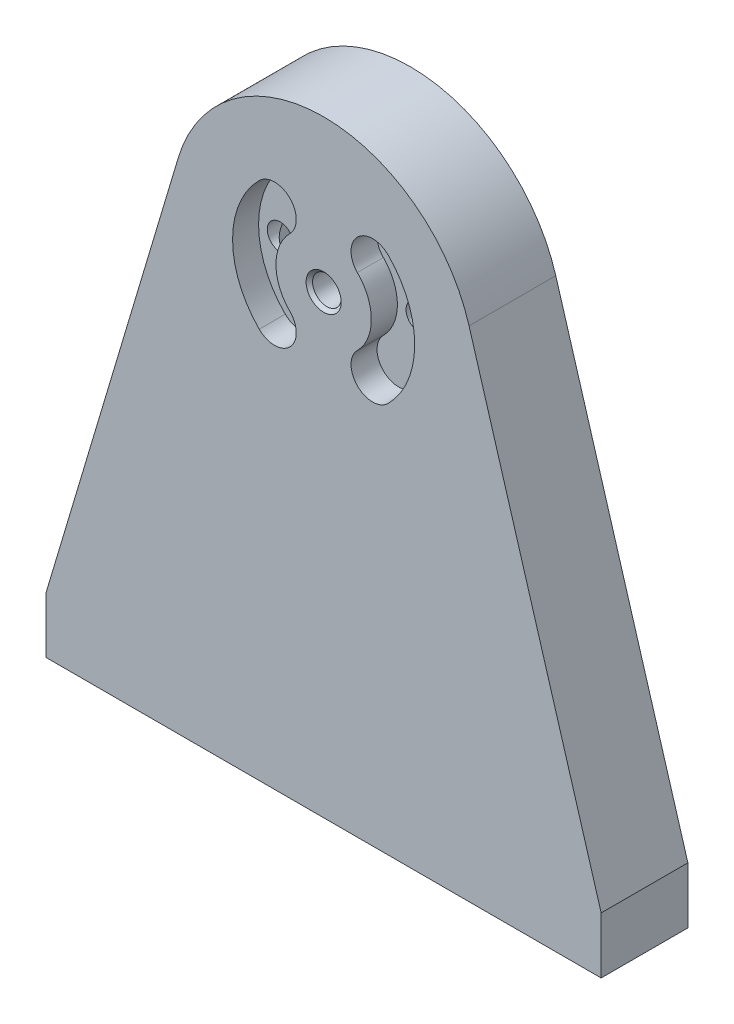
ISO-10303-21;
HEADER;
FILE_DESCRIPTION(('STEP AP214'),'2;1');
FILE_NAME('part.step','',(''),(''),'','','');
FILE_SCHEMA(('AUTOMOTIVE_DESIGN { 1 0 10303 214 1 1 1 1 }'));
ENDSEC;
DATA;
#1=APPLICATION_CONTEXT('core data for automotive mechanical design processes');
#2=APPLICATION_PROTOCOL_DEFINITION('international standard','automotive_design',2000,#1);
#3=PRODUCT_CONTEXT('',#1,'mechanical');
#4=PRODUCT('Part','Part','',(#3));
#5=PRODUCT_RELATED_PRODUCT_CATEGORY('part','',(#4));
#6=PRODUCT_DEFINITION_FORMATION('','',#4);
#7=PRODUCT_DEFINITION_CONTEXT('part definition',#1,'design');
#8=PRODUCT_DEFINITION('design','',#6,#7);
#9=PRODUCT_DEFINITION_SHAPE('','',#8);
#10=(LENGTH_UNIT() NAMED_UNIT(*) SI_UNIT(.MILLI.,.METRE.));
#11=(NAMED_UNIT(*) PLANE_ANGLE_UNIT() SI_UNIT($,.RADIAN.));
#12=(NAMED_UNIT(*) SI_UNIT($,.STERADIAN.) SOLID_ANGLE_UNIT());
#13=UNCERTAINTY_MEASURE_WITH_UNIT(LENGTH_MEASURE(1.E-05),#10,'distance_accuracy_value','');
#14=(GEOMETRIC_REPRESENTATION_CONTEXT(3) GLOBAL_UNCERTAINTY_ASSIGNED_CONTEXT((#13)) GLOBAL_UNIT_ASSIGNED_CONTEXT((#10,
#11,#12)) REPRESENTATION_CONTEXT('',''));
#15=CARTESIAN_POINT('',(0.,0.,0.));
#16=DIRECTION('',(0.,0.,1.));
#17=DIRECTION('',(1.,0.,0.));
#18=AXIS2_PLACEMENT_3D('',#15,#16,#17);
#19=CARTESIAN_POINT('',(7.99999999999999,54.,0.));
#20=DIRECTION('',(0.,-1.,0.));
#21=DIRECTION('',(1.,0.,0.));
#22=AXIS2_PLACEMENT_3D('',#19,#20,#21);
#23=CYLINDRICAL_SURFACE('',#22,1.5);
#24=CARTESIAN_POINT('',(8.,0.,0.));
#25=DIRECTION('',(0.,-1.,0.));
#26=DIRECTION('',(1.,0.,0.));
#27=AXIS2_PLACEMENT_3D('',#24,#25,#26);
#28=CIRCLE('',#27,1.5);
#29=CARTESIAN_POINT('',(9.5,0.,0.));
#30=VERTEX_POINT('',#29);
#31=EDGE_CURVE('E309',#30,#30,#28,.T.);
#32=ORIENTED_EDGE('',*,*,#31,.T.);
#33=EDGE_LOOP('',(#32));
#34=FACE_BOUND('',#33,.T.);
#35=CARTESIAN_POINT('',(7.99999999999999,52.5,0.));
#36=DIRECTION('',(0.,-0.707106781186547,-0.707106781186547));
#37=DIRECTION('',(0.,-0.707106781186547,0.707106781186547));
#38=AXIS2_PLACEMENT_3D('',#35,#36,#37);
#39=ELLIPSE('',#38,2.12132034355964,1.5);
#40=CARTESIAN_POINT('',(6.49999999999999,52.5,0.));
#41=VERTEX_POINT('',#40);
#42=CARTESIAN_POINT('',(9.5,52.5,0.));
#43=VERTEX_POINT('',#42);
#44=EDGE_CURVE('E127',#41,#43,#39,.F.);
#45=ORIENTED_EDGE('',*,*,#44,.T.);
#46=CARTESIAN_POINT('',(7.99999999999999,52.5,0.));
#47=DIRECTION('',(0.,-0.707106781186547,0.707106781186547));
#48=DIRECTION('',(0.,-0.707106781186547,-0.707106781186547));
#49=AXIS2_PLACEMENT_3D('',#46,#47,#48);
#50=ELLIPSE('',#49,2.12132034355964,1.5);
#51=EDGE_CURVE('E475',#43,#41,#50,.F.);
#52=ORIENTED_EDGE('',*,*,#51,.T.);
#53=EDGE_LOOP('',(#45,#52));
#54=FACE_BOUND('',#53,.T.);
#55=ADVANCED_FACE('F109',(#34,#54),#23,.F.);
#56=CARTESIAN_POINT('',(-8.00000000000001,54.,0.));
#57=DIRECTION('',(0.,-1.,0.));
#58=DIRECTION('',(1.,0.,0.));
#59=AXIS2_PLACEMENT_3D('',#56,#57,#58);
#60=CYLINDRICAL_SURFACE('',#59,1.5);
#61=CARTESIAN_POINT('',(-8.,0.,0.));
#62=DIRECTION('',(0.,-1.,0.));
#63=DIRECTION('',(1.,0.,0.));
#64=AXIS2_PLACEMENT_3D('',#61,#62,#63);
#65=CIRCLE('',#64,1.5);
#66=CARTESIAN_POINT('',(-6.5,0.,0.));
#67=VERTEX_POINT('',#66);
#68=EDGE_CURVE('E288',#67,#67,#65,.T.);
#69=ORIENTED_EDGE('',*,*,#68,.T.);
#70=EDGE_LOOP('',(#69));
#71=FACE_BOUND('',#70,.T.);
#72=CARTESIAN_POINT('',(-8.00000000000001,52.5,0.));
#73=DIRECTION('',(0.,-0.707106781186547,-0.707106781186547));
#74=DIRECTION('',(0.,-0.707106781186547,0.707106781186547));
#75=AXIS2_PLACEMENT_3D('',#72,#73,#74);
#76=ELLIPSE('',#75,2.12132034355964,1.5);
#77=CARTESIAN_POINT('',(-9.50000000000001,52.5,0.));
#78=VERTEX_POINT('',#77);
#79=CARTESIAN_POINT('',(-6.50000000000001,52.5,0.));
#80=VERTEX_POINT('',#79);
#81=EDGE_CURVE('E136',#78,#80,#76,.F.);
#82=ORIENTED_EDGE('',*,*,#81,.T.);
#83=CARTESIAN_POINT('',(-8.00000000000001,52.5,0.));
#84=DIRECTION('',(0.,-0.707106781186547,0.707106781186547));
#85=DIRECTION('',(0.,-0.707106781186547,-0.707106781186547));
#86=AXIS2_PLACEMENT_3D('',#83,#84,#85);
#87=ELLIPSE('',#86,2.12132034355964,1.5);
#88=EDGE_CURVE('E266',#80,#78,#87,.F.);
#89=ORIENTED_EDGE('',*,*,#88,.T.);
#90=EDGE_LOOP('',(#82,#89));
#91=FACE_BOUND('',#90,.T.);
#92=ADVANCED_FACE('F428',(#71,#91),#60,.F.);
#93=CARTESIAN_POINT('',(0.,0.,5.));
#94=DIRECTION('',(0.,0.,1.));
#95=DIRECTION('',(1.,0.,0.));
#96=AXIS2_PLACEMENT_3D('',#93,#94,#95);
#97=PLANE('',#96);
#98=CARTESIAN_POINT('',(5.65685424949235,46.8431457505076,5.));
#99=DIRECTION('',(0.,0.,1.));
#100=DIRECTION('',(1.,0.,0.));
#101=AXIS2_PLACEMENT_3D('',#98,#99,#100);
#102=CIRCLE('',#101,2.5);
#103=CARTESIAN_POINT('',(3.88908729652599,48.610912703474,5.));
#104=VERTEX_POINT('',#103);
#105=CARTESIAN_POINT('',(7.42462120245871,45.0753787975412,5.));
#106=VERTEX_POINT('',#105);
#107=EDGE_CURVE('E502',#104,#106,#102,.T.);
#108=ORIENTED_EDGE('',*,*,#107,.F.);
#109=CARTESIAN_POINT('',(0.,52.5,5.));
#110=DIRECTION('',(0.,0.,1.));
#111=DIRECTION('',(1.,0.,0.));
#112=AXIS2_PLACEMENT_3D('',#109,#110,#111);
#113=CIRCLE('',#112,5.5);
#114=CARTESIAN_POINT('',(3.88908729652599,56.389087296526,5.));
#115=VERTEX_POINT('',#114);
#116=EDGE_CURVE('E533',#104,#115,#113,.T.);
#117=ORIENTED_EDGE('',*,*,#116,.T.);
#118=CARTESIAN_POINT('',(5.65685424949235,58.1568542494924,5.));
#119=DIRECTION('',(0.,0.,1.));
#120=DIRECTION('',(1.,0.,0.));
#121=AXIS2_PLACEMENT_3D('',#118,#119,#120);
#122=CIRCLE('',#121,2.5);
#123=CARTESIAN_POINT('',(7.42462120245871,59.9246212024588,5.));
#124=VERTEX_POINT('',#123);
#125=EDGE_CURVE('E537',#124,#115,#122,.T.);
#126=ORIENTED_EDGE('',*,*,#125,.F.);
#127=CARTESIAN_POINT('',(0.,52.5,5.));
#128=DIRECTION('',(0.,0.,1.));
#129=DIRECTION('',(1.,0.,0.));
#130=AXIS2_PLACEMENT_3D('',#127,#128,#129);
#131=CIRCLE('',#130,10.5);
#132=EDGE_CURVE('E540',#106,#124,#131,.T.);
#133=ORIENTED_EDGE('',*,*,#132,.F.);
#134=EDGE_LOOP('',(#108,#117,#126,#133));
#135=FACE_BOUND('',#134,.T.);
#136=CARTESIAN_POINT('',(0.,52.5,5.));
#137=DIRECTION('',(0.,0.,1.));
#138=DIRECTION('',(1.,0.,0.));
#139=AXIS2_PLACEMENT_3D('',#136,#137,#138);
#140=CIRCLE('',#139,2.025);
#141=CARTESIAN_POINT('',(2.025,52.5,5.));
#142=VERTEX_POINT('',#141);
#143=EDGE_CURVE('E327',#142,#142,#140,.T.);
#144=ORIENTED_EDGE('',*,*,#143,.F.);
#145=EDGE_LOOP('',(#144));
#146=FACE_BOUND('',#145,.T.);
#147=DIRECTION('',(-0.286132264969927,0.958190130894271,0.));
#148=VECTOR('',#147,1.);
#149=CARTESIAN_POINT('',(31.1622056929417,9.30557747245682,5.));
#150=LINE('',#149,#148);
#151=CARTESIAN_POINT('',(32.,6.50000000000001,5.));
#152=VERTEX_POINT('',#151);
#153=CARTESIAN_POINT('',(16.7683272906497,57.5073146369737,5.));
#154=VERTEX_POINT('',#153);
#155=EDGE_CURVE('E340',#152,#154,#150,.T.);
#156=ORIENTED_EDGE('',*,*,#155,.T.);
#157=CARTESIAN_POINT('',(0.,52.5,5.));
#158=DIRECTION('',(0.,0.,1.));
#159=DIRECTION('',(1.,0.,0.));
#160=AXIS2_PLACEMENT_3D('',#157,#158,#159);
#161=CIRCLE('',#160,17.5);
#162=CARTESIAN_POINT('',(-16.7683272906497,57.5073146369737,5.));
#163=VERTEX_POINT('',#162);
#164=EDGE_CURVE('E344',#154,#163,#161,.T.);
#165=ORIENTED_EDGE('',*,*,#164,.T.);
#166=DIRECTION('',(0.286132264969927,0.958190130894271,0.));
#167=VECTOR('',#166,1.);
#168=CARTESIAN_POINT('',(-31.1622056929417,9.30557747245681,5.));
#169=LINE('',#168,#167);
#170=CARTESIAN_POINT('',(-32.,6.5,5.));
#171=VERTEX_POINT('',#170);
#172=EDGE_CURVE('E348',#171,#163,#169,.T.);
#173=ORIENTED_EDGE('',*,*,#172,.F.);
#174=DIRECTION('',(0.,1.,0.));
#175=VECTOR('',#174,1.);
#176=CARTESIAN_POINT('',(-32.,0.,5.));
#177=LINE('',#176,#175);
#178=CARTESIAN_POINT('',(-32.,0.,5.));
#179=VERTEX_POINT('',#178);
#180=EDGE_CURVE('E352',#179,#171,#177,.T.);
#181=ORIENTED_EDGE('',*,*,#180,.F.);
#182=DIRECTION('',(1.,0.,0.));
#183=VECTOR('',#182,1.);
#184=CARTESIAN_POINT('',(0.,0.,5.));
#185=LINE('',#184,#183);
#186=CARTESIAN_POINT('',(32.,0.,5.));
#187=VERTEX_POINT('',#186);
#188=EDGE_CURVE('E355',#179,#187,#185,.T.);
#189=ORIENTED_EDGE('',*,*,#188,.T.);
#190=DIRECTION('',(0.,1.,0.));
#191=VECTOR('',#190,1.);
#192=CARTESIAN_POINT('',(32.,0.,5.));
#193=LINE('',#192,#191);
#194=EDGE_CURVE('E358',#187,#152,#193,.T.);
#195=ORIENTED_EDGE('',*,*,#194,.T.);
#196=EDGE_LOOP('',(#156,#165,#173,#181,#189,#195));
#197=FACE_BOUND('',#196,.T.);
#198=CARTESIAN_POINT('',(0.,52.5,5.));
#199=DIRECTION('',(0.,0.,-1.));
#200=DIRECTION('',(-1.,0.,0.));
#201=AXIS2_PLACEMENT_3D('',#198,#199,#200);
#202=CIRCLE('',#201,5.5);
#203=CARTESIAN_POINT('',(-3.88908729652599,48.610912703474,5.));
#204=VERTEX_POINT('',#203);
#205=CARTESIAN_POINT('',(-3.88908729652599,56.389087296526,5.));
#206=VERTEX_POINT('',#205);
#207=EDGE_CURVE('E486',#204,#206,#202,.T.);
#208=ORIENTED_EDGE('',*,*,#207,.F.);
#209=CARTESIAN_POINT('',(-5.65685424949235,46.8431457505076,5.));
#210=DIRECTION('',(0.,0.,-1.));
#211=DIRECTION('',(-1.,0.,0.));
#212=AXIS2_PLACEMENT_3D('',#209,#210,#211);
#213=CIRCLE('',#212,2.5);
#214=CARTESIAN_POINT('',(-7.42462120245871,45.0753787975412,5.));
#215=VERTEX_POINT('',#214);
#216=EDGE_CURVE('E497',#204,#215,#213,.T.);
#217=ORIENTED_EDGE('',*,*,#216,.T.);
#218=CARTESIAN_POINT('',(0.,52.5,5.));
#219=DIRECTION('',(0.,0.,-1.));
#220=DIRECTION('',(-1.,0.,0.));
#221=AXIS2_PLACEMENT_3D('',#218,#219,#220);
#222=CIRCLE('',#221,10.5);
#223=CARTESIAN_POINT('',(-7.42462120245871,59.9246212024588,5.));
#224=VERTEX_POINT('',#223);
#225=EDGE_CURVE('E501',#215,#224,#222,.T.);
#226=ORIENTED_EDGE('',*,*,#225,.T.);
#227=CARTESIAN_POINT('',(-5.65685424949235,58.1568542494924,5.));
#228=DIRECTION('',(0.,0.,-1.));
#229=DIRECTION('',(-1.,0.,0.));
#230=AXIS2_PLACEMENT_3D('',#227,#228,#229);
#231=CIRCLE('',#230,2.5);
#232=EDGE_CURVE('E505',#224,#206,#231,.T.);
#233=ORIENTED_EDGE('',*,*,#232,.T.);
#234=EDGE_LOOP('',(#208,#217,#226,#233));
#235=FACE_BOUND('',#234,.T.);
#236=ADVANCED_FACE('F405',(#135,#146,#197,#235),#97,.T.);
#237=CARTESIAN_POINT('',(0.,52.5,5.));
#238=DIRECTION('',(0.,0.,-1.));
#239=DIRECTION('',(-1.,0.,0.));
#240=AXIS2_PLACEMENT_3D('',#237,#238,#239);
#241=CYLINDRICAL_SURFACE('',#240,17.5);
#242=CARTESIAN_POINT('',(0.,52.5,-5.));
#243=DIRECTION('',(0.,0.,1.));
#244=DIRECTION('',(1.,0.,0.));
#245=AXIS2_PLACEMENT_3D('',#242,#243,#244);
#246=CIRCLE('',#245,17.5);
#247=CARTESIAN_POINT('',(16.7683272906497,57.5073146369737,-5.));
#248=VERTEX_POINT('',#247);
#249=CARTESIAN_POINT('',(-16.7683272906497,57.5073146369737,-5.));
#250=VERTEX_POINT('',#249);
#251=EDGE_CURVE('E364',#248,#250,#246,.T.);
#252=ORIENTED_EDGE('',*,*,#251,.T.);
#253=DIRECTION('',(0.,0.,-1.));
#254=VECTOR('',#253,1.);
#255=CARTESIAN_POINT('',(-16.7683272906497,57.5073146369737,5.));
#256=LINE('',#255,#254);
#257=EDGE_CURVE('E118',#163,#250,#256,.T.);
#258=ORIENTED_EDGE('',*,*,#257,.F.);
#259=ORIENTED_EDGE('',*,*,#164,.F.);
#260=DIRECTION('',(0.,0.,-1.));
#261=VECTOR('',#260,1.);
#262=CARTESIAN_POINT('',(16.7683272906497,57.5073146369737,5.));
#263=LINE('',#262,#261);
#264=EDGE_CURVE('E12',#154,#248,#263,.T.);
#265=ORIENTED_EDGE('',*,*,#264,.T.);
#266=EDGE_LOOP('',(#252,#258,#259,#265));
#267=FACE_BOUND('',#266,.T.);
#268=ADVANCED_FACE('F392',(#267),#241,.T.);
#269=CARTESIAN_POINT('',(-31.1622056929417,9.30557747245681,5.));
#270=DIRECTION('',(-0.958190130894271,0.286132264969927,0.));
#271=DIRECTION('',(-0.286132264969927,-0.958190130894271,0.));
#272=AXIS2_PLACEMENT_3D('',#269,#270,#271);
#273=PLANE('',#272);
#274=DIRECTION('',(0.286132264969927,0.958190130894271,0.));
#275=VECTOR('',#274,1.);
#276=CARTESIAN_POINT('',(-31.1622056929417,9.30557747245681,-5.));
#277=LINE('',#276,#275);
#278=CARTESIAN_POINT('',(-32.,6.5,-5.));
#279=VERTEX_POINT('',#278);
#280=EDGE_CURVE('E368',#279,#250,#277,.T.);
#281=ORIENTED_EDGE('',*,*,#280,.F.);
#282=DIRECTION('',(0.,0.,-1.));
#283=VECTOR('',#282,1.);
#284=CARTESIAN_POINT('',(-32.,6.5,5.));
#285=LINE('',#284,#283);
#286=EDGE_CURVE('E385',#171,#279,#285,.T.);
#287=ORIENTED_EDGE('',*,*,#286,.F.);
#288=ORIENTED_EDGE('',*,*,#172,.T.);
#289=ORIENTED_EDGE('',*,*,#257,.T.);
#290=EDGE_LOOP('',(#281,#287,#288,#289));
#291=FACE_BOUND('',#290,.T.);
#292=ADVANCED_FACE('F389',(#291),#273,.T.);
#293=CARTESIAN_POINT('',(-32.,0.,5.));
#294=DIRECTION('',(-1.,0.,0.));
#295=DIRECTION('',(0.,0.,1.));
#296=AXIS2_PLACEMENT_3D('',#293,#294,#295);
#297=PLANE('',#296);
#298=DIRECTION('',(0.,1.,0.));
#299=VECTOR('',#298,1.);
#300=CARTESIAN_POINT('',(-32.,0.,-5.));
#301=LINE('',#300,#299);
#302=CARTESIAN_POINT('',(-32.,0.,-5.));
#303=VERTEX_POINT('',#302);
#304=EDGE_CURVE('E372',#303,#279,#301,.T.);
#305=ORIENTED_EDGE('',*,*,#304,.F.);
#306=DIRECTION('',(0.,0.,-1.));
#307=VECTOR('',#306,1.);
#308=CARTESIAN_POINT('',(-32.,0.,5.));
#309=LINE('',#308,#307);
#310=EDGE_CURVE('E383',#179,#303,#309,.T.);
#311=ORIENTED_EDGE('',*,*,#310,.F.);
#312=ORIENTED_EDGE('',*,*,#180,.T.);
#313=ORIENTED_EDGE('',*,*,#286,.T.);
#314=EDGE_LOOP('',(#305,#311,#312,#313));
#315=FACE_BOUND('',#314,.T.);
#316=ADVANCED_FACE('F401',(#315),#297,.T.);
#317=CARTESIAN_POINT('',(0.,0.,5.));
#318=DIRECTION('',(0.,1.,0.));
#319=DIRECTION('',(-1.,0.,0.));
#320=AXIS2_PLACEMENT_3D('',#317,#318,#319);
#321=PLANE('',#320);
#322=ORIENTED_EDGE('',*,*,#68,.F.);
#323=EDGE_LOOP('',(#322));
#324=FACE_BOUND('',#323,.T.);
#325=ORIENTED_EDGE('',*,*,#31,.F.);
#326=EDGE_LOOP('',(#325));
#327=FACE_BOUND('',#326,.T.);
#328=CARTESIAN_POINT('',(-22.,0.,0.));
#329=DIRECTION('',(0.,-1.,0.));
#330=DIRECTION('',(0.,0.,-1.));
#331=AXIS2_PLACEMENT_3D('',#328,#329,#330);
#332=CIRCLE('',#331,2.025);
#333=CARTESIAN_POINT('',(-22.,0.,-2.025));
#334=VERTEX_POINT('',#333);
#335=EDGE_CURVE('E292',#334,#334,#332,.T.);
#336=ORIENTED_EDGE('',*,*,#335,.F.);
#337=EDGE_LOOP('',(#336));
#338=FACE_BOUND('',#337,.T.);
#339=CARTESIAN_POINT('',(22.,0.,0.));
#340=DIRECTION('',(0.,-1.,0.));
#341=DIRECTION('',(0.,0.,-1.));
#342=AXIS2_PLACEMENT_3D('',#339,#340,#341);
#343=CIRCLE('',#342,2.025);
#344=CARTESIAN_POINT('',(22.,0.,-2.025));
#345=VERTEX_POINT('',#344);
#346=EDGE_CURVE('E318',#345,#345,#343,.T.);
#347=ORIENTED_EDGE('',*,*,#346,.F.);
#348=EDGE_LOOP('',(#347));
#349=FACE_BOUND('',#348,.T.);
#350=DIRECTION('',(1.,0.,0.));
#351=VECTOR('',#350,1.);
#352=CARTESIAN_POINT('',(0.,0.,-5.));
#353=LINE('',#352,#351);
#354=CARTESIAN_POINT('',(32.,0.,-5.));
#355=VERTEX_POINT('',#354);
#356=EDGE_CURVE('E375',#303,#355,#353,.T.);
#357=ORIENTED_EDGE('',*,*,#356,.T.);
#358=DIRECTION('',(0.,0.,-1.));
#359=VECTOR('',#358,1.);
#360=CARTESIAN_POINT('',(32.,0.,5.));
#361=LINE('',#360,#359);
#362=EDGE_CURVE('E380',#187,#355,#361,.T.);
#363=ORIENTED_EDGE('',*,*,#362,.F.);
#364=ORIENTED_EDGE('',*,*,#188,.F.);
#365=ORIENTED_EDGE('',*,*,#310,.T.);
#366=EDGE_LOOP('',(#357,#363,#364,#365));
#367=FACE_BOUND('',#366,.T.);
#368=ADVANCED_FACE('F415',(#324,#327,#338,#349,#367),#321,.F.);
#369=CARTESIAN_POINT('',(32.,0.,5.));
#370=DIRECTION('',(-1.,0.,0.));
#371=DIRECTION('',(0.,0.,1.));
#372=AXIS2_PLACEMENT_3D('',#369,#370,#371);
#373=PLANE('',#372);
#374=DIRECTION('',(0.,1.,0.));
#375=VECTOR('',#374,1.);
#376=CARTESIAN_POINT('',(32.,0.,-5.));
#377=LINE('',#376,#375);
#378=CARTESIAN_POINT('',(32.,6.50000000000001,-5.));
#379=VERTEX_POINT('',#378);
#380=EDGE_CURVE('E345',#355,#379,#377,.T.);
#381=ORIENTED_EDGE('',*,*,#380,.T.);
#382=DIRECTION('',(0.,0.,-1.));
#383=VECTOR('',#382,1.);
#384=CARTESIAN_POINT('',(32.,6.50000000000001,5.));
#385=LINE('',#384,#383);
#386=EDGE_CURVE('E360',#152,#379,#385,.T.);
#387=ORIENTED_EDGE('',*,*,#386,.F.);
#388=ORIENTED_EDGE('',*,*,#194,.F.);
#389=ORIENTED_EDGE('',*,*,#362,.T.);
#390=EDGE_LOOP('',(#381,#387,#388,#389));
#391=FACE_BOUND('',#390,.T.);
#392=ADVANCED_FACE('F412',(#391),#373,.F.);
#393=CARTESIAN_POINT('',(31.1622056929417,9.30557747245682,5.));
#394=DIRECTION('',(-0.958190130894271,-0.286132264969927,0.));
#395=DIRECTION('',(0.286132264969927,-0.958190130894271,0.));
#396=AXIS2_PLACEMENT_3D('',#393,#394,#395);
#397=PLANE('',#396);
#398=DIRECTION('',(-0.286132264969927,0.958190130894271,0.));
#399=VECTOR('',#398,1.);
#400=CARTESIAN_POINT('',(31.1622056929417,9.30557747245682,-5.));
#401=LINE('',#400,#399);
#402=EDGE_CURVE('E339',#379,#248,#401,.T.);
#403=ORIENTED_EDGE('',*,*,#402,.T.);
#404=ORIENTED_EDGE('',*,*,#264,.F.);
#405=ORIENTED_EDGE('',*,*,#155,.F.);
#406=ORIENTED_EDGE('',*,*,#386,.T.);
#407=EDGE_LOOP('',(#403,#404,#405,#406));
#408=FACE_BOUND('',#407,.T.);
#409=ADVANCED_FACE('F111',(#408),#397,.F.);
#410=CARTESIAN_POINT('',(0.,0.,-5.));
#411=DIRECTION('',(0.,0.,1.));
#412=DIRECTION('',(1.,0.,0.));
#413=AXIS2_PLACEMENT_3D('',#410,#411,#412);
#414=PLANE('',#413);
#415=CARTESIAN_POINT('',(0.,52.5,-5.));
#416=DIRECTION('',(0.,0.,1.));
#417=DIRECTION('',(1.,0.,0.));
#418=AXIS2_PLACEMENT_3D('',#415,#416,#417);
#419=CIRCLE('',#418,1.65);
#420=CARTESIAN_POINT('',(1.65,52.5,-5.));
#421=VERTEX_POINT('',#420);
#422=EDGE_CURVE('E335',#421,#421,#419,.T.);
#423=ORIENTED_EDGE('',*,*,#422,.T.);
#424=EDGE_LOOP('',(#423));
#425=FACE_BOUND('',#424,.T.);
#426=ORIENTED_EDGE('',*,*,#402,.F.);
#427=ORIENTED_EDGE('',*,*,#380,.F.);
#428=ORIENTED_EDGE('',*,*,#356,.F.);
#429=ORIENTED_EDGE('',*,*,#304,.T.);
#430=ORIENTED_EDGE('',*,*,#280,.T.);
#431=ORIENTED_EDGE('',*,*,#251,.F.);
#432=EDGE_LOOP('',(#426,#427,#428,#429,#430,#431));
#433=FACE_BOUND('',#432,.T.);
#434=ADVANCED_FACE('F396',(#425,#433),#414,.F.);
#435=CARTESIAN_POINT('',(0.,52.5,5.));
#436=DIRECTION('',(0.,0.,1.));
#437=DIRECTION('',(1.,0.,0.));
#438=AXIS2_PLACEMENT_3D('',#435,#436,#437);
#439=CYLINDRICAL_SURFACE('',#438,1.65);
#440=ORIENTED_EDGE('',*,*,#422,.F.);
#441=EDGE_LOOP('',(#440));
#442=FACE_BOUND('',#441,.T.);
#443=CARTESIAN_POINT('',(0.,52.5,4.625));
#444=DIRECTION('',(0.,0.,1.));
#445=DIRECTION('',(1.,0.,0.));
#446=AXIS2_PLACEMENT_3D('',#443,#444,#445);
#447=CIRCLE('',#446,1.65);
#448=CARTESIAN_POINT('',(1.65,52.5,4.625));
#449=VERTEX_POINT('',#448);
#450=EDGE_CURVE('E331',#449,#449,#447,.T.);
#451=ORIENTED_EDGE('',*,*,#450,.T.);
#452=EDGE_LOOP('',(#451));
#453=FACE_BOUND('',#452,.T.);
#454=ADVANCED_FACE('F584',(#442,#453),#439,.F.);
#455=CARTESIAN_POINT('',(0.,52.5,5.));
#456=DIRECTION('',(0.,0.,1.));
#457=DIRECTION('',(1.,0.,0.));
#458=AXIS2_PLACEMENT_3D('',#455,#456,#457);
#459=CONICAL_SURFACE('',#458,2.025,0.785398163397447);
#460=ORIENTED_EDGE('',*,*,#450,.F.);
#461=EDGE_LOOP('',(#460));
#462=FACE_BOUND('',#461,.T.);
#463=ORIENTED_EDGE('',*,*,#143,.T.);
#464=EDGE_LOOP('',(#463));
#465=FACE_BOUND('',#464,.T.);
#466=ADVANCED_FACE('F581',(#462,#465),#459,.F.);
#467=CARTESIAN_POINT('',(22.,12.,0.));
#468=DIRECTION('',(0.,-1.,0.));
#469=DIRECTION('',(0.,0.,-1.));
#470=AXIS2_PLACEMENT_3D('',#467,#468,#469);
#471=CONICAL_SURFACE('',#470,1.65,1.02974425867665);
#472=CARTESIAN_POINT('',(22.,12.9914200213955,0.));
#473=VERTEX_POINT('',#472);
#474=VERTEX_LOOP('',#473);
#475=FACE_BOUND('',#474,.T.);
#476=CARTESIAN_POINT('',(22.,12.,0.));
#477=DIRECTION('',(0.,-1.,0.));
#478=DIRECTION('',(0.,0.,-1.));
#479=AXIS2_PLACEMENT_3D('',#476,#477,#478);
#480=CIRCLE('',#479,1.65);
#481=CARTESIAN_POINT('',(22.,12.,-1.65));
#482=VERTEX_POINT('',#481);
#483=EDGE_CURVE('E324',#482,#482,#480,.T.);
#484=ORIENTED_EDGE('',*,*,#483,.T.);
#485=EDGE_LOOP('',(#484));
#486=FACE_BOUND('',#485,.T.);
#487=ADVANCED_FACE('F583',(#475,#486),#471,.F.);
#488=CARTESIAN_POINT('',(22.,0.,0.));
#489=DIRECTION('',(0.,-1.,0.));
#490=DIRECTION('',(0.,0.,-1.));
#491=AXIS2_PLACEMENT_3D('',#488,#489,#490);
#492=CYLINDRICAL_SURFACE('',#491,1.65);
#493=ORIENTED_EDGE('',*,*,#483,.F.);
#494=EDGE_LOOP('',(#493));
#495=FACE_BOUND('',#494,.T.);
#496=CARTESIAN_POINT('',(22.,0.375000000000004,0.));
#497=DIRECTION('',(0.,-1.,0.));
#498=DIRECTION('',(0.,0.,-1.));
#499=AXIS2_PLACEMENT_3D('',#496,#497,#498);
#500=CIRCLE('',#499,1.65);
#501=CARTESIAN_POINT('',(22.,0.375000000000004,-1.65));
#502=VERTEX_POINT('',#501);
#503=EDGE_CURVE('E321',#502,#502,#500,.T.);
#504=ORIENTED_EDGE('',*,*,#503,.T.);
#505=EDGE_LOOP('',(#504));
#506=FACE_BOUND('',#505,.T.);
#507=ADVANCED_FACE('F591',(#495,#506),#492,.F.);
#508=CARTESIAN_POINT('',(22.,0.,0.));
#509=DIRECTION('',(0.,-1.,0.));
#510=DIRECTION('',(0.,0.,-1.));
#511=AXIS2_PLACEMENT_3D('',#508,#509,#510);
#512=CONICAL_SURFACE('',#511,2.025,0.785398163397446);
#513=ORIENTED_EDGE('',*,*,#503,.F.);
#514=EDGE_LOOP('',(#513));
#515=FACE_BOUND('',#514,.T.);
#516=ORIENTED_EDGE('',*,*,#346,.T.);
#517=EDGE_LOOP('',(#516));
#518=FACE_BOUND('',#517,.T.);
#519=ADVANCED_FACE('F661',(#515,#518),#512,.F.);
#520=CARTESIAN_POINT('',(-22.,12.,0.));
#521=DIRECTION('',(0.,-1.,0.));
#522=DIRECTION('',(0.,0.,-1.));
#523=AXIS2_PLACEMENT_3D('',#520,#521,#522);
#524=CONICAL_SURFACE('',#523,1.65,1.02974425867665);
#525=CARTESIAN_POINT('',(-22.,12.9914200213955,0.));
#526=VERTEX_POINT('',#525);
#527=VERTEX_LOOP('',#526);
#528=FACE_BOUND('',#527,.T.);
#529=CARTESIAN_POINT('',(-22.,12.,0.));
#530=DIRECTION('',(0.,-1.,0.));
#531=DIRECTION('',(0.,0.,-1.));
#532=AXIS2_PLACEMENT_3D('',#529,#530,#531);
#533=CIRCLE('',#532,1.65);
#534=CARTESIAN_POINT('',(-22.,12.,-1.65));
#535=VERTEX_POINT('',#534);
#536=EDGE_CURVE('E315',#535,#535,#533,.T.);
#537=ORIENTED_EDGE('',*,*,#536,.T.);
#538=EDGE_LOOP('',(#537));
#539=FACE_BOUND('',#538,.T.);
#540=ADVANCED_FACE('F673',(#528,#539),#524,.F.);
#541=CARTESIAN_POINT('',(-22.,0.,0.));
#542=DIRECTION('',(0.,-1.,0.));
#543=DIRECTION('',(0.,0.,-1.));
#544=AXIS2_PLACEMENT_3D('',#541,#542,#543);
#545=CYLINDRICAL_SURFACE('',#544,1.65);
#546=ORIENTED_EDGE('',*,*,#536,.F.);
#547=EDGE_LOOP('',(#546));
#548=FACE_BOUND('',#547,.T.);
#549=CARTESIAN_POINT('',(-22.,0.374999999999996,0.));
#550=DIRECTION('',(0.,-1.,0.));
#551=DIRECTION('',(0.,0.,-1.));
#552=AXIS2_PLACEMENT_3D('',#549,#550,#551);
#553=CIRCLE('',#552,1.65);
#554=CARTESIAN_POINT('',(-22.,0.374999999999996,-1.65));
#555=VERTEX_POINT('',#554);
#556=EDGE_CURVE('E296',#555,#555,#553,.T.);
#557=ORIENTED_EDGE('',*,*,#556,.T.);
#558=EDGE_LOOP('',(#557));
#559=FACE_BOUND('',#558,.T.);
#560=ADVANCED_FACE('F685',(#548,#559),#545,.F.);
#561=CARTESIAN_POINT('',(-22.,0.,0.));
#562=DIRECTION('',(0.,-1.,0.));
#563=DIRECTION('',(0.,0.,-1.));
#564=AXIS2_PLACEMENT_3D('',#561,#562,#563);
#565=CONICAL_SURFACE('',#564,2.025,0.785398163397446);
#566=ORIENTED_EDGE('',*,*,#556,.F.);
#567=EDGE_LOOP('',(#566));
#568=FACE_BOUND('',#567,.T.);
#569=ORIENTED_EDGE('',*,*,#335,.T.);
#570=EDGE_LOOP('',(#569));
#571=FACE_BOUND('',#570,.T.);
#572=ADVANCED_FACE('F695',(#568,#571),#565,.F.);
#573=CARTESIAN_POINT('',(5.65685424949235,46.8431457505076,2.));
#574=DIRECTION('',(0.,0.,1.));
#575=DIRECTION('',(1.,0.,0.));
#576=AXIS2_PLACEMENT_3D('',#573,#574,#575);
#577=CYLINDRICAL_SURFACE('',#576,2.5);
#578=ORIENTED_EDGE('',*,*,#107,.T.);
#579=DIRECTION('',(0.,0.,1.));
#580=VECTOR('',#579,1.);
#581=CARTESIAN_POINT('',(7.42462120245871,45.0753787975412,2.));
#582=LINE('',#581,#580);
#583=CARTESIAN_POINT('',(7.42462120245871,45.0753787975412,2.));
#584=VERTEX_POINT('',#583);
#585=EDGE_CURVE('E524',#584,#106,#582,.T.);
#586=ORIENTED_EDGE('',*,*,#585,.F.);
#587=CARTESIAN_POINT('',(5.65685424949235,46.8431457505076,2.));
#588=DIRECTION('',(0.,0.,1.));
#589=DIRECTION('',(1.,0.,0.));
#590=AXIS2_PLACEMENT_3D('',#587,#588,#589);
#591=CIRCLE('',#590,2.5);
#592=CARTESIAN_POINT('',(3.88908729652599,48.610912703474,2.));
#593=VERTEX_POINT('',#592);
#594=EDGE_CURVE('E300',#593,#584,#591,.T.);
#595=ORIENTED_EDGE('',*,*,#594,.F.);
#596=DIRECTION('',(0.,0.,1.));
#597=VECTOR('',#596,1.);
#598=CARTESIAN_POINT('',(3.88908729652599,48.610912703474,2.));
#599=LINE('',#598,#597);
#600=EDGE_CURVE('E469',#593,#104,#599,.T.);
#601=ORIENTED_EDGE('',*,*,#600,.T.);
#602=EDGE_LOOP('',(#578,#586,#595,#601));
#603=FACE_BOUND('',#602,.T.);
#604=ADVANCED_FACE('F562',(#603),#577,.F.);
#605=CARTESIAN_POINT('',(0.,52.5,2.));
#606=DIRECTION('',(0.,0.,1.));
#607=DIRECTION('',(1.,0.,0.));
#608=AXIS2_PLACEMENT_3D('',#605,#606,#607);
#609=CYLINDRICAL_SURFACE('',#608,5.5);
#610=ORIENTED_EDGE('',*,*,#116,.F.);
#611=ORIENTED_EDGE('',*,*,#600,.F.);
#612=CARTESIAN_POINT('',(0.,52.5,2.));
#613=DIRECTION('',(0.,0.,1.));
#614=DIRECTION('',(1.,0.,0.));
#615=AXIS2_PLACEMENT_3D('',#612,#613,#614);
#616=CIRCLE('',#615,5.5);
#617=CARTESIAN_POINT('',(3.88908729652599,56.389087296526,2.));
#618=VERTEX_POINT('',#617);
#619=EDGE_CURVE('E528',#593,#618,#616,.T.);
#620=ORIENTED_EDGE('',*,*,#619,.T.);
#621=DIRECTION('',(0.,0.,1.));
#622=VECTOR('',#621,1.);
#623=CARTESIAN_POINT('',(3.88908729652599,56.389087296526,2.));
#624=LINE('',#623,#622);
#625=EDGE_CURVE('E472',#618,#115,#624,.T.);
#626=ORIENTED_EDGE('',*,*,#625,.T.);
#627=EDGE_LOOP('',(#610,#611,#620,#626));
#628=FACE_BOUND('',#627,.T.);
#629=ADVANCED_FACE('F574',(#628),#609,.T.);
#630=CARTESIAN_POINT('',(5.65685424949235,58.1568542494924,2.));
#631=DIRECTION('',(0.,0.,1.));
#632=DIRECTION('',(1.,0.,0.));
#633=AXIS2_PLACEMENT_3D('',#630,#631,#632);
#634=CYLINDRICAL_SURFACE('',#633,2.5);
#635=ORIENTED_EDGE('',*,*,#125,.T.);
#636=ORIENTED_EDGE('',*,*,#625,.F.);
#637=CARTESIAN_POINT('',(5.65685424949235,58.1568542494924,2.));
#638=DIRECTION('',(0.,0.,1.));
#639=DIRECTION('',(1.,0.,0.));
#640=AXIS2_PLACEMENT_3D('',#637,#638,#639);
#641=CIRCLE('',#640,2.5);
#642=CARTESIAN_POINT('',(7.42462120245871,59.9246212024588,2.));
#643=VERTEX_POINT('',#642);
#644=EDGE_CURVE('E548',#643,#618,#641,.T.);
#645=ORIENTED_EDGE('',*,*,#644,.F.);
#646=DIRECTION('',(0.,0.,1.));
#647=VECTOR('',#646,1.);
#648=CARTESIAN_POINT('',(7.42462120245871,59.9246212024588,2.));
#649=LINE('',#648,#647);
#650=EDGE_CURVE('E529',#643,#124,#649,.T.);
#651=ORIENTED_EDGE('',*,*,#650,.T.);
#652=EDGE_LOOP('',(#635,#636,#645,#651));
#653=FACE_BOUND('',#652,.T.);
#654=ADVANCED_FACE('F572',(#653),#634,.F.);
#655=CARTESIAN_POINT('',(0.,52.5,2.));
#656=DIRECTION('',(0.,0.,1.));
#657=DIRECTION('',(1.,0.,0.));
#658=AXIS2_PLACEMENT_3D('',#655,#656,#657);
#659=CYLINDRICAL_SURFACE('',#658,10.5);
#660=ORIENTED_EDGE('',*,*,#132,.T.);
#661=ORIENTED_EDGE('',*,*,#650,.F.);
#662=CARTESIAN_POINT('',(0.,52.5,2.));
#663=DIRECTION('',(0.,0.,1.));
#664=DIRECTION('',(1.,0.,0.));
#665=AXIS2_PLACEMENT_3D('',#662,#663,#664);
#666=CIRCLE('',#665,10.5);
#667=EDGE_CURVE('E550',#584,#643,#666,.T.);
#668=ORIENTED_EDGE('',*,*,#667,.F.);
#669=ORIENTED_EDGE('',*,*,#585,.T.);
#670=EDGE_LOOP('',(#660,#661,#668,#669));
#671=FACE_BOUND('',#670,.T.);
#672=ADVANCED_FACE('F567',(#671),#659,.F.);
#673=CARTESIAN_POINT('',(2.82842712474618,49.6715728752538,2.));
#674=DIRECTION('',(0.,0.,1.));
#675=DIRECTION('',(1.,0.,0.));
#676=AXIS2_PLACEMENT_3D('',#673,#674,#675);
#677=PLANE('',#676);
#678=CARTESIAN_POINT('',(8.,52.5,2.));
#679=DIRECTION('',(0.,0.,1.));
#680=DIRECTION('',(1.,0.,0.));
#681=AXIS2_PLACEMENT_3D('',#678,#679,#680);
#682=CIRCLE('',#681,1.5);
#683=CARTESIAN_POINT('',(9.5,52.5,2.));
#684=VERTEX_POINT('',#683);
#685=EDGE_CURVE('E922',#684,#684,#682,.T.);
#686=ORIENTED_EDGE('',*,*,#685,.F.);
#687=EDGE_LOOP('',(#686));
#688=FACE_BOUND('',#687,.T.);
#689=ORIENTED_EDGE('',*,*,#594,.T.);
#690=ORIENTED_EDGE('',*,*,#667,.T.);
#691=ORIENTED_EDGE('',*,*,#644,.T.);
#692=ORIENTED_EDGE('',*,*,#619,.F.);
#693=EDGE_LOOP('',(#689,#690,#691,#692));
#694=FACE_BOUND('',#693,.T.);
#695=ADVANCED_FACE('F560',(#688,#694),#677,.T.);
#696=CARTESIAN_POINT('',(-5.65685424949235,46.8431457505076,2.));
#697=DIRECTION('',(0.,0.,1.));
#698=DIRECTION('',(1.,0.,0.));
#699=AXIS2_PLACEMENT_3D('',#696,#697,#698);
#700=CYLINDRICAL_SURFACE('',#699,2.5);
#701=ORIENTED_EDGE('',*,*,#216,.F.);
#702=DIRECTION('',(0.,0.,1.));
#703=VECTOR('',#702,1.);
#704=CARTESIAN_POINT('',(-3.88908729652599,48.610912703474,2.));
#705=LINE('',#704,#703);
#706=CARTESIAN_POINT('',(-3.88908729652599,48.610912703474,2.));
#707=VERTEX_POINT('',#706);
#708=EDGE_CURVE('E496',#707,#204,#705,.T.);
#709=ORIENTED_EDGE('',*,*,#708,.F.);
#710=CARTESIAN_POINT('',(-5.65685424949235,46.8431457505076,2.));
#711=DIRECTION('',(0.,0.,-1.));
#712=DIRECTION('',(-1.,0.,0.));
#713=AXIS2_PLACEMENT_3D('',#710,#711,#712);
#714=CIRCLE('',#713,2.5);
#715=CARTESIAN_POINT('',(-7.42462120245871,45.0753787975412,2.));
#716=VERTEX_POINT('',#715);
#717=EDGE_CURVE('E481',#707,#716,#714,.T.);
#718=ORIENTED_EDGE('',*,*,#717,.T.);
#719=DIRECTION('',(0.,0.,1.));
#720=VECTOR('',#719,1.);
#721=CARTESIAN_POINT('',(-7.42462120245871,45.0753787975412,2.));
#722=LINE('',#721,#720);
#723=EDGE_CURVE('E311',#716,#215,#722,.T.);
#724=ORIENTED_EDGE('',*,*,#723,.T.);
#725=EDGE_LOOP('',(#701,#709,#718,#724));
#726=FACE_BOUND('',#725,.T.);
#727=ADVANCED_FACE('F759',(#726),#700,.F.);
#728=CARTESIAN_POINT('',(0.,52.5,2.));
#729=DIRECTION('',(0.,0.,1.));
#730=DIRECTION('',(1.,0.,0.));
#731=AXIS2_PLACEMENT_3D('',#728,#729,#730);
#732=CYLINDRICAL_SURFACE('',#731,10.5);
#733=ORIENTED_EDGE('',*,*,#225,.F.);
#734=ORIENTED_EDGE('',*,*,#723,.F.);
#735=CARTESIAN_POINT('',(0.,52.5,2.));
#736=DIRECTION('',(0.,0.,-1.));
#737=DIRECTION('',(-1.,0.,0.));
#738=AXIS2_PLACEMENT_3D('',#735,#736,#737);
#739=CIRCLE('',#738,10.5);
#740=CARTESIAN_POINT('',(-7.42462120245871,59.9246212024588,2.));
#741=VERTEX_POINT('',#740);
#742=EDGE_CURVE('E485',#716,#741,#739,.T.);
#743=ORIENTED_EDGE('',*,*,#742,.T.);
#744=DIRECTION('',(0.,0.,1.));
#745=VECTOR('',#744,1.);
#746=CARTESIAN_POINT('',(-7.42462120245871,59.9246212024588,2.));
#747=LINE('',#746,#745);
#748=EDGE_CURVE('E518',#741,#224,#747,.T.);
#749=ORIENTED_EDGE('',*,*,#748,.T.);
#750=EDGE_LOOP('',(#733,#734,#743,#749));
#751=FACE_BOUND('',#750,.T.);
#752=ADVANCED_FACE('F765',(#751),#732,.F.);
#753=CARTESIAN_POINT('',(-5.65685424949235,58.1568542494924,2.));
#754=DIRECTION('',(0.,0.,1.));
#755=DIRECTION('',(1.,0.,0.));
#756=AXIS2_PLACEMENT_3D('',#753,#754,#755);
#757=CYLINDRICAL_SURFACE('',#756,2.5);
#758=ORIENTED_EDGE('',*,*,#232,.F.);
#759=ORIENTED_EDGE('',*,*,#748,.F.);
#760=CARTESIAN_POINT('',(-5.65685424949235,58.1568542494924,2.));
#761=DIRECTION('',(0.,0.,-1.));
#762=DIRECTION('',(-1.,0.,0.));
#763=AXIS2_PLACEMENT_3D('',#760,#761,#762);
#764=CIRCLE('',#763,2.5);
#765=CARTESIAN_POINT('',(-3.88908729652599,56.389087296526,2.));
#766=VERTEX_POINT('',#765);
#767=EDGE_CURVE('E489',#741,#766,#764,.T.);
#768=ORIENTED_EDGE('',*,*,#767,.T.);
#769=DIRECTION('',(0.,0.,1.));
#770=VECTOR('',#769,1.);
#771=CARTESIAN_POINT('',(-3.88908729652599,56.389087296526,2.));
#772=LINE('',#771,#770);
#773=EDGE_CURVE('E515',#766,#206,#772,.T.);
#774=ORIENTED_EDGE('',*,*,#773,.T.);
#775=EDGE_LOOP('',(#758,#759,#768,#774));
#776=FACE_BOUND('',#775,.T.);
#777=ADVANCED_FACE('F777',(#776),#757,.F.);
#778=CARTESIAN_POINT('',(0.,52.5,2.));
#779=DIRECTION('',(0.,0.,1.));
#780=DIRECTION('',(1.,0.,0.));
#781=AXIS2_PLACEMENT_3D('',#778,#779,#780);
#782=CYLINDRICAL_SURFACE('',#781,5.5);
#783=ORIENTED_EDGE('',*,*,#207,.T.);
#784=ORIENTED_EDGE('',*,*,#773,.F.);
#785=CARTESIAN_POINT('',(0.,52.5,2.));
#786=DIRECTION('',(0.,0.,-1.));
#787=DIRECTION('',(-1.,0.,0.));
#788=AXIS2_PLACEMENT_3D('',#785,#786,#787);
#789=CIRCLE('',#788,5.5);
#790=EDGE_CURVE('E492',#707,#766,#789,.T.);
#791=ORIENTED_EDGE('',*,*,#790,.F.);
#792=ORIENTED_EDGE('',*,*,#708,.T.);
#793=EDGE_LOOP('',(#783,#784,#791,#792));
#794=FACE_BOUND('',#793,.T.);
#795=ADVANCED_FACE('F787',(#794),#782,.T.);
#796=CARTESIAN_POINT('',(-2.82842712474618,49.6715728752538,2.));
#797=DIRECTION('',(0.,0.,-1.));
#798=DIRECTION('',(-1.,0.,0.));
#799=AXIS2_PLACEMENT_3D('',#796,#797,#798);
#800=PLANE('',#799);
#801=CARTESIAN_POINT('',(-8.,52.5,2.));
#802=DIRECTION('',(0.,0.,1.));
#803=DIRECTION('',(1.,0.,0.));
#804=AXIS2_PLACEMENT_3D('',#801,#802,#803);
#805=CIRCLE('',#804,1.5);
#806=CARTESIAN_POINT('',(-6.5,52.5,2.));
#807=VERTEX_POINT('',#806);
#808=EDGE_CURVE('E921',#807,#807,#805,.T.);
#809=ORIENTED_EDGE('',*,*,#808,.F.);
#810=EDGE_LOOP('',(#809));
#811=FACE_BOUND('',#810,.T.);
#812=ORIENTED_EDGE('',*,*,#717,.F.);
#813=ORIENTED_EDGE('',*,*,#790,.T.);
#814=ORIENTED_EDGE('',*,*,#767,.F.);
#815=ORIENTED_EDGE('',*,*,#742,.F.);
#816=EDGE_LOOP('',(#812,#813,#814,#815));
#817=FACE_BOUND('',#816,.T.);
#818=ADVANCED_FACE('F797',(#811,#817),#800,.F.);
#819=CARTESIAN_POINT('',(-8.,52.5,-3.));
#820=DIRECTION('',(0.,0.,1.));
#821=DIRECTION('',(1.,0.,0.));
#822=AXIS2_PLACEMENT_3D('',#819,#820,#821);
#823=CYLINDRICAL_SURFACE('',#822,1.5);
#824=ORIENTED_EDGE('',*,*,#808,.T.);
#825=EDGE_LOOP('',(#824));
#826=FACE_BOUND('',#825,.T.);
#827=CARTESIAN_POINT('',(-8.00000000000001,52.5,0.));
#828=DIRECTION('',(0.,-0.707106781186547,0.707106781186547));
#829=DIRECTION('',(0.,-0.707106781186547,-0.707106781186547));
#830=AXIS2_PLACEMENT_3D('',#827,#828,#829);
#831=ELLIPSE('',#830,2.12132034355964,1.5);
#832=CARTESIAN_POINT('',(-8.,54.,1.5));
#833=VERTEX_POINT('',#832);
#834=EDGE_CURVE('E271',#833,#78,#831,.T.);
#835=ORIENTED_EDGE('',*,*,#834,.F.);
#836=EDGE_CURVE('E285',#80,#833,#831,.T.);
#837=ORIENTED_EDGE('',*,*,#836,.F.);
#838=ORIENTED_EDGE('',*,*,#81,.F.);
#839=EDGE_LOOP('',(#835,#837,#838));
#840=FACE_BOUND('',#839,.T.);
#841=ADVANCED_FACE('F828',(#826,#840),#823,.F.);
#842=CARTESIAN_POINT('',(8.,52.5,-3.));
#843=DIRECTION('',(0.,0.,1.));
#844=DIRECTION('',(1.,0.,0.));
#845=AXIS2_PLACEMENT_3D('',#842,#843,#844);
#846=CYLINDRICAL_SURFACE('',#845,1.5);
#847=ORIENTED_EDGE('',*,*,#685,.T.);
#848=EDGE_LOOP('',(#847));
#849=FACE_BOUND('',#848,.T.);
#850=CARTESIAN_POINT('',(7.99999999999999,52.5,0.));
#851=DIRECTION('',(0.,-0.707106781186547,0.707106781186547));
#852=DIRECTION('',(0.,-0.707106781186547,-0.707106781186547));
#853=AXIS2_PLACEMENT_3D('',#850,#851,#852);
#854=ELLIPSE('',#853,2.12132034355964,1.5);
#855=CARTESIAN_POINT('',(8.,54.,1.5));
#856=VERTEX_POINT('',#855);
#857=EDGE_CURVE('E460',#856,#41,#854,.T.);
#858=ORIENTED_EDGE('',*,*,#857,.F.);
#859=EDGE_CURVE('E454',#43,#856,#854,.T.);
#860=ORIENTED_EDGE('',*,*,#859,.F.);
#861=ORIENTED_EDGE('',*,*,#44,.F.);
#862=EDGE_LOOP('',(#858,#860,#861));
#863=FACE_BOUND('',#862,.T.);
#864=ADVANCED_FACE('F838',(#849,#863),#846,.F.);
#865=CARTESIAN_POINT('',(-8.00000000000001,54.,0.));
#866=DIRECTION('',(0.,-1.,0.));
#867=DIRECTION('',(1.,0.,0.));
#868=AXIS2_PLACEMENT_3D('',#865,#866,#867);
#869=PLANE('',#868);
#870=CARTESIAN_POINT('',(-8.00000000000001,54.,0.));
#871=DIRECTION('',(0.,-1.,0.));
#872=DIRECTION('',(1.,0.,0.));
#873=AXIS2_PLACEMENT_3D('',#870,#871,#872);
#874=CIRCLE('',#873,1.5);
#875=CARTESIAN_POINT('',(-8.,54.,-1.5));
#876=VERTEX_POINT('',#875);
#877=EDGE_CURVE('E283',#876,#833,#874,.T.);
#878=ORIENTED_EDGE('',*,*,#877,.T.);
#879=EDGE_CURVE('E279',#833,#876,#874,.T.);
#880=ORIENTED_EDGE('',*,*,#879,.T.);
#881=EDGE_LOOP('',(#878,#880));
#882=FACE_BOUND('',#881,.T.);
#883=ADVANCED_FACE('F290',(#882),#869,.T.);
#884=CARTESIAN_POINT('',(-8.00000000000001,52.5,0.));
#885=DIRECTION('',(0.,-0.707106781186547,-0.707106781186547));
#886=DIRECTION('',(0.,-0.707106781186547,0.707106781186547));
#887=AXIS2_PLACEMENT_3D('',#884,#885,#886);
#888=ELLIPSE('',#887,2.12132034355964,1.5);
#889=EDGE_CURVE('E262',#876,#80,#888,.T.);
#890=ORIENTED_EDGE('',*,*,#889,.T.);
#891=ORIENTED_EDGE('',*,*,#836,.T.);
#892=ORIENTED_EDGE('',*,*,#877,.F.);
#893=EDGE_LOOP('',(#890,#891,#892));
#894=FACE_BOUND('',#893,.T.);
#895=ADVANCED_FACE('F284',(#894),#60,.F.);
#896=ORIENTED_EDGE('',*,*,#879,.F.);
#897=ORIENTED_EDGE('',*,*,#834,.T.);
#898=EDGE_CURVE('E265',#78,#876,#888,.T.);
#899=ORIENTED_EDGE('',*,*,#898,.T.);
#900=EDGE_LOOP('',(#896,#897,#899));
#901=FACE_BOUND('',#900,.T.);
#902=ADVANCED_FACE('F277',(#901),#60,.F.);
#903=CARTESIAN_POINT('',(-8.,52.5,-3.));
#904=DIRECTION('',(0.,0.,1.));
#905=DIRECTION('',(1.,0.,0.));
#906=AXIS2_PLACEMENT_3D('',#903,#904,#905);
#907=CIRCLE('',#906,1.5);
#908=CARTESIAN_POINT('',(-6.5,52.5,-3.));
#909=VERTEX_POINT('',#908);
#910=EDGE_CURVE('E272',#909,#909,#907,.T.);
#911=ORIENTED_EDGE('',*,*,#910,.F.);
#912=EDGE_LOOP('',(#911));
#913=FACE_BOUND('',#912,.T.);
#914=ORIENTED_EDGE('',*,*,#88,.F.);
#915=ORIENTED_EDGE('',*,*,#889,.F.);
#916=ORIENTED_EDGE('',*,*,#898,.F.);
#917=EDGE_LOOP('',(#914,#915,#916));
#918=FACE_BOUND('',#917,.T.);
#919=ADVANCED_FACE('F264',(#913,#918),#823,.F.);
#920=CARTESIAN_POINT('',(-8.,52.5,-3.));
#921=DIRECTION('',(0.,0.,1.));
#922=DIRECTION('',(1.,0.,0.));
#923=AXIS2_PLACEMENT_3D('',#920,#921,#922);
#924=PLANE('',#923);
#925=ORIENTED_EDGE('',*,*,#910,.T.);
#926=EDGE_LOOP('',(#925));
#927=FACE_BOUND('',#926,.T.);
#928=ADVANCED_FACE('F449',(#927),#924,.T.);
#929=CARTESIAN_POINT('',(7.99999999999999,54.,0.));
#930=DIRECTION('',(0.,-1.,0.));
#931=DIRECTION('',(1.,0.,0.));
#932=AXIS2_PLACEMENT_3D('',#929,#930,#931);
#933=PLANE('',#932);
#934=CARTESIAN_POINT('',(7.99999999999999,54.,0.));
#935=DIRECTION('',(0.,-1.,0.));
#936=DIRECTION('',(1.,0.,0.));
#937=AXIS2_PLACEMENT_3D('',#934,#935,#936);
#938=CIRCLE('',#937,1.5);
#939=CARTESIAN_POINT('',(8.,54.,-1.5));
#940=VERTEX_POINT('',#939);
#941=EDGE_CURVE('E308',#940,#856,#938,.T.);
#942=ORIENTED_EDGE('',*,*,#941,.T.);
#943=EDGE_CURVE('E304',#856,#940,#938,.T.);
#944=ORIENTED_EDGE('',*,*,#943,.T.);
#945=EDGE_LOOP('',(#942,#944));
#946=FACE_BOUND('',#945,.T.);
#947=ADVANCED_FACE('F444',(#946),#933,.T.);
#948=CARTESIAN_POINT('',(7.99999999999999,52.5,0.));
#949=DIRECTION('',(0.,-0.707106781186547,-0.707106781186547));
#950=DIRECTION('',(0.,-0.707106781186547,0.707106781186547));
#951=AXIS2_PLACEMENT_3D('',#948,#949,#950);
#952=ELLIPSE('',#951,2.12132034355964,1.5);
#953=EDGE_CURVE('E281',#940,#43,#952,.T.);
#954=ORIENTED_EDGE('',*,*,#953,.T.);
#955=ORIENTED_EDGE('',*,*,#859,.T.);
#956=ORIENTED_EDGE('',*,*,#941,.F.);
#957=EDGE_LOOP('',(#954,#955,#956));
#958=FACE_BOUND('',#957,.T.);
#959=ADVANCED_FACE('F432',(#958),#23,.F.);
#960=ORIENTED_EDGE('',*,*,#943,.F.);
#961=ORIENTED_EDGE('',*,*,#857,.T.);
#962=EDGE_CURVE('E462',#41,#940,#952,.T.);
#963=ORIENTED_EDGE('',*,*,#962,.T.);
#964=EDGE_LOOP('',(#960,#961,#963));
#965=FACE_BOUND('',#964,.T.);
#966=ADVANCED_FACE('F431',(#965),#23,.F.);
#967=CARTESIAN_POINT('',(8.,52.5,-3.));
#968=DIRECTION('',(0.,0.,1.));
#969=DIRECTION('',(1.,0.,0.));
#970=AXIS2_PLACEMENT_3D('',#967,#968,#969);
#971=CIRCLE('',#970,1.5);
#972=CARTESIAN_POINT('',(9.5,52.5,-3.));
#973=VERTEX_POINT('',#972);
#974=EDGE_CURVE('E919',#973,#973,#971,.T.);
#975=ORIENTED_EDGE('',*,*,#974,.F.);
#976=EDGE_LOOP('',(#975));
#977=FACE_BOUND('',#976,.T.);
#978=ORIENTED_EDGE('',*,*,#51,.F.);
#979=ORIENTED_EDGE('',*,*,#953,.F.);
#980=ORIENTED_EDGE('',*,*,#962,.F.);
#981=EDGE_LOOP('',(#978,#979,#980));
#982=FACE_BOUND('',#981,.T.);
#983=ADVANCED_FACE('F441',(#977,#982),#846,.F.);
#984=CARTESIAN_POINT('',(8.,52.5,-3.));
#985=DIRECTION('',(0.,0.,1.));
#986=DIRECTION('',(1.,0.,0.));
#987=AXIS2_PLACEMENT_3D('',#984,#985,#986);
#988=PLANE('',#987);
#989=ORIENTED_EDGE('',*,*,#974,.T.);
#990=EDGE_LOOP('',(#989));
#991=FACE_BOUND('',#990,.T.);
#992=ADVANCED_FACE('F904',(#991),#988,.T.);
#993=CLOSED_SHELL('',(#55,#92,#236,#268,#292,#316,#368,#392,#409,#434,#454,#466,#487,#507,#519,
#540,#560,#572,#604,#629,#654,#672,#695,#727,#752,#777,#795,#818,#841,#864,#883,#895,#902,#919,
#928,#947,#959,#966,#983,#992));
#994=MANIFOLD_SOLID_BREP('B2',#993);
#995=ADVANCED_BREP_SHAPE_REPRESENTATION('',(#18,#994),#14);
#996=SHAPE_DEFINITION_REPRESENTATION(#9,#995);
ENDSEC;
END-ISO-10303-21;
